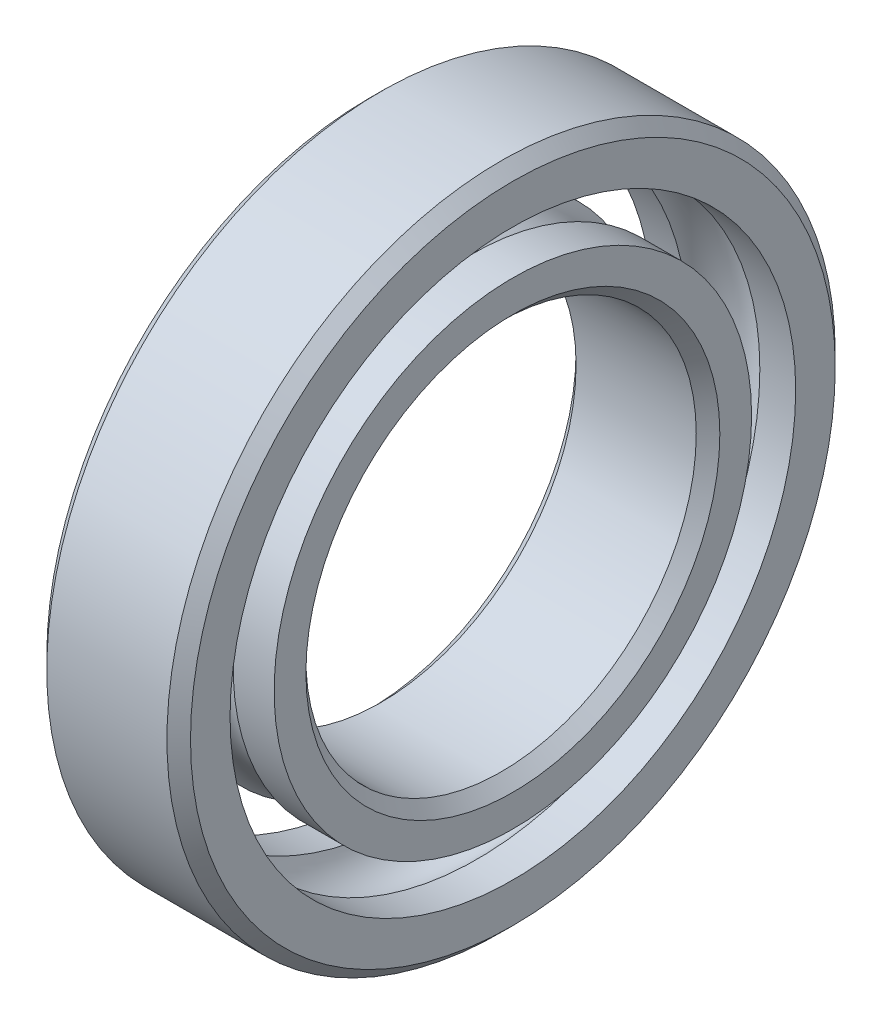
ISO-10303-21;
HEADER;
FILE_DESCRIPTION(('STEP AP214'),'2;1');
FILE_NAME('part.step','',(''),(''),'','','');
FILE_SCHEMA(('AUTOMOTIVE_DESIGN { 1 0 10303 214 1 1 1 1 }'));
ENDSEC;
DATA;
#1=APPLICATION_CONTEXT('core data for automotive mechanical design processes');
#2=APPLICATION_PROTOCOL_DEFINITION('international standard','automotive_design',2000,#1);
#3=PRODUCT_CONTEXT('',#1,'mechanical');
#4=PRODUCT('Part','Part','',(#3));
#5=PRODUCT_RELATED_PRODUCT_CATEGORY('part','',(#4));
#6=PRODUCT_DEFINITION_FORMATION('','',#4);
#7=PRODUCT_DEFINITION_CONTEXT('part definition',#1,'design');
#8=PRODUCT_DEFINITION('design','',#6,#7);
#9=PRODUCT_DEFINITION_SHAPE('','',#8);
#10=(LENGTH_UNIT() NAMED_UNIT(*) SI_UNIT(.MILLI.,.METRE.));
#11=(NAMED_UNIT(*) PLANE_ANGLE_UNIT() SI_UNIT($,.RADIAN.));
#12=(NAMED_UNIT(*) SI_UNIT($,.STERADIAN.) SOLID_ANGLE_UNIT());
#13=UNCERTAINTY_MEASURE_WITH_UNIT(LENGTH_MEASURE(1.E-05),#10,'distance_accuracy_value','');
#14=(GEOMETRIC_REPRESENTATION_CONTEXT(3) GLOBAL_UNCERTAINTY_ASSIGNED_CONTEXT((#13)) GLOBAL_UNIT_ASSIGNED_CONTEXT((#10,
#11,#12)) REPRESENTATION_CONTEXT('',''));
#15=CARTESIAN_POINT('',(0.,0.,0.));
#16=DIRECTION('',(0.,0.,1.));
#17=DIRECTION('',(1.,0.,0.));
#18=AXIS2_PLACEMENT_3D('',#15,#16,#17);
#19=CARTESIAN_POINT('',(3.04815397328827,16.6942919704326,0.));
#20=DIRECTION('',(1.,0.,0.));
#21=DIRECTION('',(0.,0.,-1.));
#22=AXIS2_PLACEMENT_3D('',#19,#20,#21);
#23=PLANE('',#22);
#24=CARTESIAN_POINT('',(3.04815397328827,7.9161610728181,0.));
#25=DIRECTION('',(1.,0.,0.));
#26=DIRECTION('',(0.,0.,-1.));
#27=AXIS2_PLACEMENT_3D('',#24,#25,#26);
#28=CIRCLE('',#27,10.1256794284013);
#29=CARTESIAN_POINT('',(3.04815397328827,7.9161610728181,-10.1256794284013));
#30=VERTEX_POINT('',#29);
#31=EDGE_CURVE('E68',#30,#30,#28,.T.);
#32=ORIENTED_EDGE('',*,*,#31,.T.);
#33=EDGE_LOOP('',(#32));
#34=FACE_BOUND('',#33,.T.);
#35=CARTESIAN_POINT('',(3.04815397328827,7.9161610728181,0.));
#36=DIRECTION('',(1.,0.,0.));
#37=DIRECTION('',(0.,0.,-1.));
#38=AXIS2_PLACEMENT_3D('',#35,#36,#37);
#39=CIRCLE('',#38,8.77813089761447);
#40=CARTESIAN_POINT('',(3.04815397328827,7.9161610728181,-8.77813089761447));
#41=VERTEX_POINT('',#40);
#42=EDGE_CURVE('E46',#41,#41,#39,.T.);
#43=ORIENTED_EDGE('',*,*,#42,.F.);
#44=EDGE_LOOP('',(#43));
#45=FACE_BOUND('',#44,.T.);
#46=ADVANCED_FACE('F42',(#34,#45),#23,.T.);
#47=CARTESIAN_POINT('',(2.54815397328827,7.9161610728181,0.));
#48=DIRECTION('',(1.,0.,0.));
#49=DIRECTION('',(0.,0.,-1.));
#50=AXIS2_PLACEMENT_3D('',#47,#48,#49);
#51=CONICAL_SURFACE('',#50,8.27813089761447,0.785398163397448);
#52=ORIENTED_EDGE('',*,*,#42,.T.);
#53=EDGE_LOOP('',(#52));
#54=FACE_BOUND('',#53,.T.);
#55=CARTESIAN_POINT('',(2.54815397328827,7.9161610728181,0.));
#56=DIRECTION('',(1.,0.,0.));
#57=DIRECTION('',(0.,0.,-1.));
#58=AXIS2_PLACEMENT_3D('',#55,#56,#57);
#59=CIRCLE('',#58,8.27813089761447);
#60=CARTESIAN_POINT('',(2.54815397328827,7.9161610728181,-8.27813089761447));
#61=VERTEX_POINT('',#60);
#62=EDGE_CURVE('E66',#61,#61,#59,.T.);
#63=ORIENTED_EDGE('',*,*,#62,.F.);
#64=EDGE_LOOP('',(#63));
#65=FACE_BOUND('',#64,.T.);
#66=ADVANCED_FACE('F75',(#54,#65),#51,.F.);
#67=CARTESIAN_POINT('',(-7.72155070764632,7.9161610728181,0.));
#68=DIRECTION('',(1.,0.,0.));
#69=DIRECTION('',(0.,0.,-1.));
#70=AXIS2_PLACEMENT_3D('',#67,#68,#69);
#71=CYLINDRICAL_SURFACE('',#70,8.27813089761447);
#72=ORIENTED_EDGE('',*,*,#62,.T.);
#73=EDGE_LOOP('',(#72));
#74=FACE_BOUND('',#73,.T.);
#75=CARTESIAN_POINT('',(-2.54815397328827,7.9161610728181,0.));
#76=DIRECTION('',(1.,0.,0.));
#77=DIRECTION('',(0.,0.,-1.));
#78=AXIS2_PLACEMENT_3D('',#75,#76,#77);
#79=CIRCLE('',#78,8.27813089761447);
#80=CARTESIAN_POINT('',(-2.54815397328827,7.9161610728181,-8.27813089761447));
#81=VERTEX_POINT('',#80);
#82=EDGE_CURVE('E63',#81,#81,#79,.T.);
#83=ORIENTED_EDGE('',*,*,#82,.F.);
#84=EDGE_LOOP('',(#83));
#85=FACE_BOUND('',#84,.T.);
#86=ADVANCED_FACE('F83',(#74,#85),#71,.F.);
#87=CARTESIAN_POINT('',(-3.04815397328827,7.9161610728181,0.));
#88=DIRECTION('',(-1.,0.,0.));
#89=DIRECTION('',(0.,0.,1.));
#90=AXIS2_PLACEMENT_3D('',#87,#88,#89);
#91=CONICAL_SURFACE('',#90,8.77813089761447,0.785398163397448);
#92=ORIENTED_EDGE('',*,*,#82,.T.);
#93=EDGE_LOOP('',(#92));
#94=FACE_BOUND('',#93,.T.);
#95=CARTESIAN_POINT('',(-3.04815397328827,7.9161610728181,0.));
#96=DIRECTION('',(1.,0.,0.));
#97=DIRECTION('',(0.,0.,-1.));
#98=AXIS2_PLACEMENT_3D('',#95,#96,#97);
#99=CIRCLE('',#98,8.77813089761447);
#100=CARTESIAN_POINT('',(-3.04815397328827,7.9161610728181,-8.77813089761447));
#101=VERTEX_POINT('',#100);
#102=EDGE_CURVE('E60',#101,#101,#99,.T.);
#103=ORIENTED_EDGE('',*,*,#102,.F.);
#104=EDGE_LOOP('',(#103));
#105=FACE_BOUND('',#104,.T.);
#106=ADVANCED_FACE('F103',(#94,#105),#91,.F.);
#107=CARTESIAN_POINT('',(-3.04815397328827,16.6942919704326,0.));
#108=DIRECTION('',(-1.,0.,0.));
#109=DIRECTION('',(0.,0.,1.));
#110=AXIS2_PLACEMENT_3D('',#107,#108,#109);
#111=PLANE('',#110);
#112=ORIENTED_EDGE('',*,*,#102,.T.);
#113=EDGE_LOOP('',(#112));
#114=FACE_BOUND('',#113,.T.);
#115=CARTESIAN_POINT('',(-3.04815397328827,7.9161610728181,0.));
#116=DIRECTION('',(1.,0.,0.));
#117=DIRECTION('',(0.,0.,-1.));
#118=AXIS2_PLACEMENT_3D('',#115,#116,#117);
#119=CIRCLE('',#118,10.1256794284013);
#120=CARTESIAN_POINT('',(-3.04815397328827,7.9161610728181,-10.1256794284013));
#121=VERTEX_POINT('',#120);
#122=EDGE_CURVE('E55',#121,#121,#119,.T.);
#123=ORIENTED_EDGE('',*,*,#122,.F.);
#124=EDGE_LOOP('',(#123));
#125=FACE_BOUND('',#124,.T.);
#126=ADVANCED_FACE('F96',(#114,#125),#111,.T.);
#127=CARTESIAN_POINT('',(-7.72155070764632,7.9161610728181,0.));
#128=DIRECTION('',(1.,0.,0.));
#129=DIRECTION('',(0.,0.,-1.));
#130=AXIS2_PLACEMENT_3D('',#127,#128,#129);
#131=CYLINDRICAL_SURFACE('',#130,10.1256794284013);
#132=ORIENTED_EDGE('',*,*,#122,.T.);
#133=EDGE_LOOP('',(#132));
#134=FACE_BOUND('',#133,.T.);
#135=CARTESIAN_POINT('',(-1.31050975771642,7.9161610728181,0.));
#136=DIRECTION('',(1.,0.,0.));
#137=DIRECTION('',(0.,0.,-1.));
#138=AXIS2_PLACEMENT_3D('',#135,#136,#137);
#139=CIRCLE('',#138,10.1256794284013);
#140=CARTESIAN_POINT('',(-1.31050975771642,7.9161610728181,-10.1256794284013));
#141=VERTEX_POINT('',#140);
#142=EDGE_CURVE('E50',#141,#141,#139,.T.);
#143=ORIENTED_EDGE('',*,*,#142,.F.);
#144=EDGE_LOOP('',(#143));
#145=FACE_BOUND('',#144,.T.);
#146=ADVANCED_FACE('F90',(#134,#145),#131,.T.);
#147=CARTESIAN_POINT('',(0.,7.9161610728181,0.));
#148=DIRECTION('',(1.,0.,0.));
#149=DIRECTION('',(0.,0.,-1.));
#150=AXIS2_PLACEMENT_3D('',#147,#148,#149);
#151=TOROIDAL_SURFACE('',#150,11.2252811589575,1.71071908591447);
#152=ORIENTED_EDGE('',*,*,#142,.T.);
#153=EDGE_LOOP('',(#152));
#154=FACE_BOUND('',#153,.T.);
#155=CARTESIAN_POINT('',(1.31050975771642,7.9161610728181,0.));
#156=DIRECTION('',(1.,0.,0.));
#157=DIRECTION('',(0.,0.,-1.));
#158=AXIS2_PLACEMENT_3D('',#155,#156,#157);
#159=CIRCLE('',#158,10.1256794284013);
#160=CARTESIAN_POINT('',(1.31050975771642,7.9161610728181,-10.1256794284013));
#161=VERTEX_POINT('',#160);
#162=EDGE_CURVE('E11',#161,#161,#159,.T.);
#163=ORIENTED_EDGE('',*,*,#162,.F.);
#164=EDGE_LOOP('',(#163));
#165=FACE_BOUND('',#164,.T.);
#166=ADVANCED_FACE('F86',(#154,#165),#151,.F.);
#167=CARTESIAN_POINT('',(-7.72155070764632,7.9161610728181,0.));
#168=DIRECTION('',(1.,0.,0.));
#169=DIRECTION('',(0.,0.,-1.));
#170=AXIS2_PLACEMENT_3D('',#167,#168,#169);
#171=CYLINDRICAL_SURFACE('',#170,10.1256794284013);
#172=ORIENTED_EDGE('',*,*,#162,.T.);
#173=EDGE_LOOP('',(#172));
#174=FACE_BOUND('',#173,.T.);
#175=ORIENTED_EDGE('',*,*,#31,.F.);
#176=EDGE_LOOP('',(#175));
#177=FACE_BOUND('',#176,.T.);
#178=ADVANCED_FACE('F44',(#174,#177),#171,.T.);
#179=OPEN_SHELL('',(#46,#66,#86,#106,#126,#146,#166,#178));
#180=SHELL_BASED_SURFACE_MODEL('B2',(#179));
#181=CARTESIAN_POINT('',(-7.72155070764632,7.9161610728181,0.));
#182=DIRECTION('',(1.,0.,0.));
#183=DIRECTION('',(0.,0.,-1.));
#184=AXIS2_PLACEMENT_3D('',#181,#182,#183);
#185=CYLINDRICAL_SURFACE('',#184,11.9955458282572);
#186=CARTESIAN_POINT('',(3.04815397328827,7.9161610728181,0.));
#187=DIRECTION('',(1.,0.,0.));
#188=DIRECTION('',(0.,0.,-1.));
#189=AXIS2_PLACEMENT_3D('',#186,#187,#188);
#190=CIRCLE('',#189,11.9955458282572);
#191=CARTESIAN_POINT('',(3.04815397328827,7.9161610728181,-11.9955458282572));
#192=VERTEX_POINT('',#191);
#193=EDGE_CURVE('E173',#192,#192,#190,.T.);
#194=ORIENTED_EDGE('',*,*,#193,.T.);
#195=EDGE_LOOP('',(#194));
#196=FACE_BOUND('',#195,.T.);
#197=CARTESIAN_POINT('',(1.52749865143658,7.9161610728181,0.));
#198=DIRECTION('',(1.,0.,0.));
#199=DIRECTION('',(0.,0.,-1.));
#200=AXIS2_PLACEMENT_3D('',#197,#198,#199);
#201=CIRCLE('',#200,11.9955458282572);
#202=CARTESIAN_POINT('',(1.52749865143658,7.9161610728181,-11.9955458282572));
#203=VERTEX_POINT('',#202);
#204=EDGE_CURVE('E195',#203,#203,#201,.T.);
#205=ORIENTED_EDGE('',*,*,#204,.F.);
#206=EDGE_LOOP('',(#205));
#207=FACE_BOUND('',#206,.T.);
#208=ADVANCED_FACE('F169',(#196,#207),#185,.F.);
#209=CARTESIAN_POINT('',(0.,7.9161610728181,0.));
#210=DIRECTION('',(1.,0.,0.));
#211=DIRECTION('',(0.,0.,-1.));
#212=AXIS2_PLACEMENT_3D('',#209,#210,#211);
#213=TOROIDAL_SURFACE('',#212,11.2252811589575,1.71071908591447);
#214=ORIENTED_EDGE('',*,*,#204,.T.);
#215=EDGE_LOOP('',(#214));
#216=FACE_BOUND('',#215,.T.);
#217=CARTESIAN_POINT('',(-1.52749865143658,7.9161610728181,0.));
#218=DIRECTION('',(1.,0.,0.));
#219=DIRECTION('',(0.,0.,-1.));
#220=AXIS2_PLACEMENT_3D('',#217,#218,#219);
#221=CIRCLE('',#220,11.9955458282572);
#222=CARTESIAN_POINT('',(-1.52749865143658,7.9161610728181,-11.9955458282572));
#223=VERTEX_POINT('',#222);
#224=EDGE_CURVE('E193',#223,#223,#221,.T.);
#225=ORIENTED_EDGE('',*,*,#224,.F.);
#226=EDGE_LOOP('',(#225));
#227=FACE_BOUND('',#226,.T.);
#228=ADVANCED_FACE('F229',(#216,#227),#213,.F.);
#229=CARTESIAN_POINT('',(-7.72155070764632,7.9161610728181,0.));
#230=DIRECTION('',(1.,0.,0.));
#231=DIRECTION('',(0.,0.,-1.));
#232=AXIS2_PLACEMENT_3D('',#229,#230,#231);
#233=CYLINDRICAL_SURFACE('',#232,11.9955458282572);
#234=ORIENTED_EDGE('',*,*,#224,.T.);
#235=EDGE_LOOP('',(#234));
#236=FACE_BOUND('',#235,.T.);
#237=CARTESIAN_POINT('',(-3.04815397328827,7.9161610728181,0.));
#238=DIRECTION('',(1.,0.,0.));
#239=DIRECTION('',(0.,0.,-1.));
#240=AXIS2_PLACEMENT_3D('',#237,#238,#239);
#241=CIRCLE('',#240,11.9955458282572);
#242=CARTESIAN_POINT('',(-3.04815397328827,7.9161610728181,-11.9955458282572));
#243=VERTEX_POINT('',#242);
#244=EDGE_CURVE('E190',#243,#243,#241,.T.);
#245=ORIENTED_EDGE('',*,*,#244,.F.);
#246=EDGE_LOOP('',(#245));
#247=FACE_BOUND('',#246,.T.);
#248=ADVANCED_FACE('F225',(#236,#247),#233,.F.);
#249=CARTESIAN_POINT('',(-3.04815397328827,19.9117069010754,0.));
#250=DIRECTION('',(-1.,0.,0.));
#251=DIRECTION('',(0.,0.,1.));
#252=AXIS2_PLACEMENT_3D('',#249,#250,#251);
#253=PLANE('',#252);
#254=ORIENTED_EDGE('',*,*,#244,.T.);
#255=EDGE_LOOP('',(#254));
#256=FACE_BOUND('',#255,.T.);
#257=CARTESIAN_POINT('',(-3.04815397328827,7.9161610728181,0.));
#258=DIRECTION('',(1.,0.,0.));
#259=DIRECTION('',(0.,0.,-1.));
#260=AXIS2_PLACEMENT_3D('',#257,#258,#259);
#261=CIRCLE('',#260,13.6724314203005);
#262=CARTESIAN_POINT('',(-3.04815397328827,7.9161610728181,-13.6724314203005));
#263=VERTEX_POINT('',#262);
#264=EDGE_CURVE('E187',#263,#263,#261,.T.);
#265=ORIENTED_EDGE('',*,*,#264,.F.);
#266=EDGE_LOOP('',(#265));
#267=FACE_BOUND('',#266,.T.);
#268=ADVANCED_FACE('F221',(#256,#267),#253,.T.);
#269=CARTESIAN_POINT('',(-2.54815397328827,7.9161610728181,0.));
#270=DIRECTION('',(1.,0.,0.));
#271=DIRECTION('',(0.,0.,-1.));
#272=AXIS2_PLACEMENT_3D('',#269,#270,#271);
#273=CONICAL_SURFACE('',#272,14.1724314203005,0.785398163397449);
#274=ORIENTED_EDGE('',*,*,#264,.T.);
#275=EDGE_LOOP('',(#274));
#276=FACE_BOUND('',#275,.T.);
#277=CARTESIAN_POINT('',(-2.54815397328827,7.9161610728181,0.));
#278=DIRECTION('',(1.,0.,0.));
#279=DIRECTION('',(0.,0.,-1.));
#280=AXIS2_PLACEMENT_3D('',#277,#278,#279);
#281=CIRCLE('',#280,14.1724314203005);
#282=CARTESIAN_POINT('',(-2.54815397328827,7.9161610728181,-14.1724314203005));
#283=VERTEX_POINT('',#282);
#284=EDGE_CURVE('E182',#283,#283,#281,.T.);
#285=ORIENTED_EDGE('',*,*,#284,.F.);
#286=EDGE_LOOP('',(#285));
#287=FACE_BOUND('',#286,.T.);
#288=ADVANCED_FACE('F214',(#276,#287),#273,.T.);
#289=CARTESIAN_POINT('',(-7.72155070764632,7.9161610728181,0.));
#290=DIRECTION('',(1.,0.,0.));
#291=DIRECTION('',(0.,0.,-1.));
#292=AXIS2_PLACEMENT_3D('',#289,#290,#291);
#293=CYLINDRICAL_SURFACE('',#292,14.1724314203005);
#294=ORIENTED_EDGE('',*,*,#284,.T.);
#295=EDGE_LOOP('',(#294));
#296=FACE_BOUND('',#295,.T.);
#297=CARTESIAN_POINT('',(2.54815397328827,7.9161610728181,0.));
#298=DIRECTION('',(1.,0.,0.));
#299=DIRECTION('',(0.,0.,-1.));
#300=AXIS2_PLACEMENT_3D('',#297,#298,#299);
#301=CIRCLE('',#300,14.1724314203005);
#302=CARTESIAN_POINT('',(2.54815397328827,7.9161610728181,-14.1724314203005));
#303=VERTEX_POINT('',#302);
#304=EDGE_CURVE('E177',#303,#303,#301,.T.);
#305=ORIENTED_EDGE('',*,*,#304,.F.);
#306=EDGE_LOOP('',(#305));
#307=FACE_BOUND('',#306,.T.);
#308=ADVANCED_FACE('F209',(#296,#307),#293,.T.);
#309=CARTESIAN_POINT('',(3.04815397328827,7.9161610728181,0.));
#310=DIRECTION('',(-1.,0.,0.));
#311=DIRECTION('',(0.,0.,1.));
#312=AXIS2_PLACEMENT_3D('',#309,#310,#311);
#313=CONICAL_SURFACE('',#312,13.6724314203005,0.785398163397448);
#314=ORIENTED_EDGE('',*,*,#304,.T.);
#315=EDGE_LOOP('',(#314));
#316=FACE_BOUND('',#315,.T.);
#317=CARTESIAN_POINT('',(3.04815397328827,7.9161610728181,0.));
#318=DIRECTION('',(1.,0.,0.));
#319=DIRECTION('',(0.,0.,-1.));
#320=AXIS2_PLACEMENT_3D('',#317,#318,#319);
#321=CIRCLE('',#320,13.6724314203005);
#322=CARTESIAN_POINT('',(3.04815397328827,7.9161610728181,-13.6724314203005));
#323=VERTEX_POINT('',#322);
#324=EDGE_CURVE('E41',#323,#323,#321,.T.);
#325=ORIENTED_EDGE('',*,*,#324,.F.);
#326=EDGE_LOOP('',(#325));
#327=FACE_BOUND('',#326,.T.);
#328=ADVANCED_FACE('F205',(#316,#327),#313,.T.);
#329=CARTESIAN_POINT('',(3.04815397328827,19.9117069010754,0.));
#330=DIRECTION('',(1.,0.,0.));
#331=DIRECTION('',(0.,0.,-1.));
#332=AXIS2_PLACEMENT_3D('',#329,#330,#331);
#333=PLANE('',#332);
#334=ORIENTED_EDGE('',*,*,#324,.T.);
#335=EDGE_LOOP('',(#334));
#336=FACE_BOUND('',#335,.T.);
#337=ORIENTED_EDGE('',*,*,#193,.F.);
#338=EDGE_LOOP('',(#337));
#339=FACE_BOUND('',#338,.T.);
#340=ADVANCED_FACE('F171',(#336,#339),#333,.T.);
#341=OPEN_SHELL('',(#208,#228,#248,#268,#288,#308,#328,#340));
#342=SHELL_BASED_SURFACE_MODEL('B6',(#341));
#343=CARTESIAN_POINT('',(0.,19.1414422317756,0.));
#344=DIRECTION('',(1.,0.,0.));
#345=DIRECTION('',(0.,-1.,0.));
#346=AXIS2_PLACEMENT_3D('',#343,#344,#345);
#347=SPHERICAL_SURFACE('',#346,1.71071908591447);
#348=CARTESIAN_POINT('',(1.71071908591447,19.1414422317756,0.));
#349=VERTEX_POINT('',#348);
#350=VERTEX_LOOP('',#349);
#351=FACE_BOUND('',#350,.T.);
#352=ADVANCED_FACE('F291',(#351),#347,.T.);
#353=CLOSED_SHELL('',(#352));
#354=MANIFOLD_SOLID_BREP('B36',#353);
#355=ADVANCED_BREP_SHAPE_REPRESENTATION('',(#18,#354),#14);
#356=MANIFOLD_SURFACE_SHAPE_REPRESENTATION('',(#18,#180,#342),#14);
#357=SHAPE_REPRESENTATION('',(#18),#14);
#358=SHAPE_DEFINITION_REPRESENTATION(#9,#357);
#359=SHAPE_REPRESENTATION_RELATIONSHIP('','',#357,#355);
#360=SHAPE_REPRESENTATION_RELATIONSHIP('','',#357,#356);
ENDSEC;
END-ISO-10303-21;
